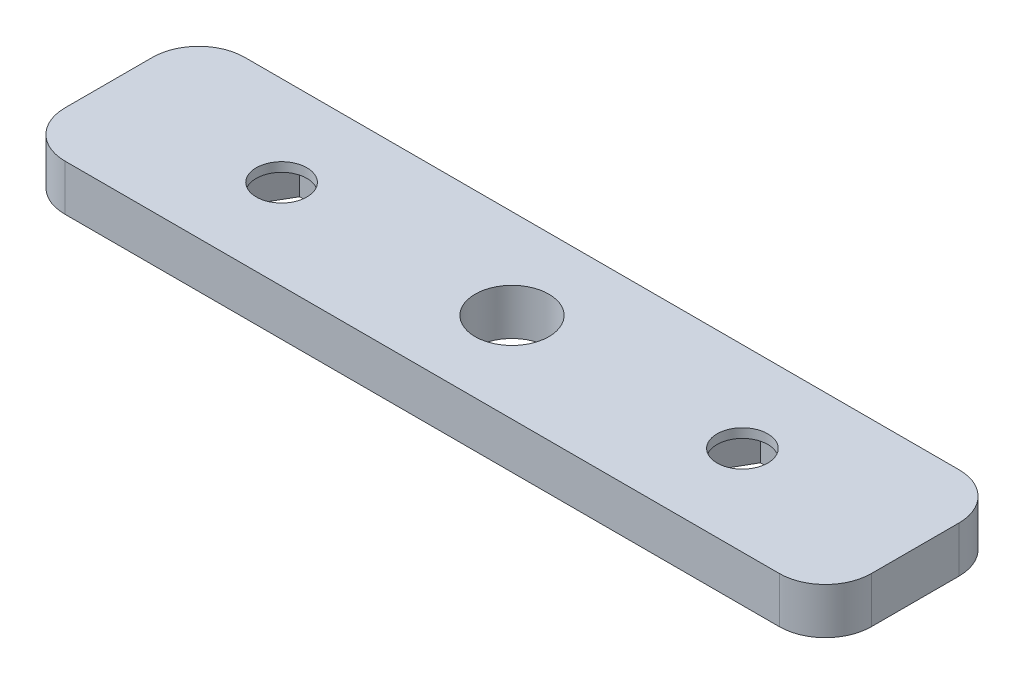
ISO-10303-21;
HEADER;
FILE_DESCRIPTION(('STEP AP214'),'2;1');
FILE_NAME('part.step','',(''),(''),'','','');
FILE_SCHEMA(('AUTOMOTIVE_DESIGN { 1 0 10303 214 1 1 1 1 }'));
ENDSEC;
DATA;
#1=APPLICATION_CONTEXT('core data for automotive mechanical design processes');
#2=APPLICATION_PROTOCOL_DEFINITION('international standard','automotive_design',2000,#1);
#3=PRODUCT_CONTEXT('',#1,'mechanical');
#4=PRODUCT('Part','Part','',(#3));
#5=PRODUCT_RELATED_PRODUCT_CATEGORY('part','',(#4));
#6=PRODUCT_DEFINITION_FORMATION('','',#4);
#7=PRODUCT_DEFINITION_CONTEXT('part definition',#1,'design');
#8=PRODUCT_DEFINITION('design','',#6,#7);
#9=PRODUCT_DEFINITION_SHAPE('','',#8);
#10=(LENGTH_UNIT() NAMED_UNIT(*) SI_UNIT(.MILLI.,.METRE.));
#11=(NAMED_UNIT(*) PLANE_ANGLE_UNIT() SI_UNIT($,.RADIAN.));
#12=(NAMED_UNIT(*) SI_UNIT($,.STERADIAN.) SOLID_ANGLE_UNIT());
#13=UNCERTAINTY_MEASURE_WITH_UNIT(LENGTH_MEASURE(1.E-05),#10,'distance_accuracy_value','');
#14=(GEOMETRIC_REPRESENTATION_CONTEXT(3) GLOBAL_UNCERTAINTY_ASSIGNED_CONTEXT((#13)) GLOBAL_UNIT_ASSIGNED_CONTEXT((#10,
#11,#12)) REPRESENTATION_CONTEXT('',''));
#15=CARTESIAN_POINT('',(0.,0.,0.));
#16=DIRECTION('',(0.,0.,1.));
#17=DIRECTION('',(1.,0.,0.));
#18=AXIS2_PLACEMENT_3D('',#15,#16,#17);
#19=CARTESIAN_POINT('',(0.,0.,0.));
#20=DIRECTION('',(0.,-1.,0.));
#21=DIRECTION('',(0.,0.,-1.));
#22=AXIS2_PLACEMENT_3D('',#19,#20,#21);
#23=PLANE('',#22);
#24=DIRECTION('',(0.5,0.,0.866025403784439));
#25=VECTOR('',#24,1.);
#26=CARTESIAN_POINT('',(17.8638040039984,0.,3.7));
#27=LINE('',#26,#25);
#28=CARTESIAN_POINT('',(15.7276080079968,0.,0.));
#29=VERTEX_POINT('',#28);
#30=CARTESIAN_POINT('',(17.8638040039984,0.,3.7));
#31=VERTEX_POINT('',#30);
#32=EDGE_CURVE('E214',#29,#31,#27,.T.);
#33=ORIENTED_EDGE('',*,*,#32,.T.);
#34=DIRECTION('',(1.,0.,0.));
#35=VECTOR('',#34,1.);
#36=CARTESIAN_POINT('',(22.1361959960016,0.,3.70000000000001));
#37=LINE('',#36,#35);
#38=CARTESIAN_POINT('',(22.1361959960016,0.,3.70000000000001));
#39=VERTEX_POINT('',#38);
#40=EDGE_CURVE('E66',#31,#39,#37,.T.);
#41=ORIENTED_EDGE('',*,*,#40,.T.);
#42=DIRECTION('',(0.5,0.,-0.866025403784438));
#43=VECTOR('',#42,1.);
#44=CARTESIAN_POINT('',(24.2723919920032,0.,0.));
#45=LINE('',#44,#43);
#46=CARTESIAN_POINT('',(24.2723919920032,0.,0.));
#47=VERTEX_POINT('',#46);
#48=EDGE_CURVE('E226',#39,#47,#45,.T.);
#49=ORIENTED_EDGE('',*,*,#48,.T.);
#50=DIRECTION('',(-0.499999999999999,0.,-0.866025403784439));
#51=VECTOR('',#50,1.);
#52=CARTESIAN_POINT('',(22.1361959960016,0.,-3.7));
#53=LINE('',#52,#51);
#54=CARTESIAN_POINT('',(22.1361959960016,0.,-3.7));
#55=VERTEX_POINT('',#54);
#56=EDGE_CURVE('E229',#47,#55,#53,.T.);
#57=ORIENTED_EDGE('',*,*,#56,.T.);
#58=DIRECTION('',(-1.,0.,0.));
#59=VECTOR('',#58,1.);
#60=CARTESIAN_POINT('',(17.8638040039984,0.,-3.7));
#61=LINE('',#60,#59);
#62=CARTESIAN_POINT('',(17.8638040039984,0.,-3.7));
#63=VERTEX_POINT('',#62);
#64=EDGE_CURVE('E232',#55,#63,#61,.T.);
#65=ORIENTED_EDGE('',*,*,#64,.T.);
#66=DIRECTION('',(-0.500000000000001,0.,0.866025403784438));
#67=VECTOR('',#66,1.);
#68=CARTESIAN_POINT('',(15.7276080079968,0.,0.));
#69=LINE('',#68,#67);
#70=EDGE_CURVE('E235',#63,#29,#69,.T.);
#71=ORIENTED_EDGE('',*,*,#70,.T.);
#72=EDGE_LOOP('',(#33,#41,#49,#57,#65,#71));
#73=FACE_BOUND('',#72,.T.);
#74=CARTESIAN_POINT('',(0.,0.,0.));
#75=DIRECTION('',(0.,-1.,0.));
#76=DIRECTION('',(0.,0.,-1.));
#77=AXIS2_PLACEMENT_3D('',#74,#75,#76);
#78=CIRCLE('',#77,3.2);
#79=CARTESIAN_POINT('',(0.,0.,-3.2));
#80=VERTEX_POINT('',#79);
#81=EDGE_CURVE('E260',#80,#80,#78,.F.);
#82=ORIENTED_EDGE('',*,*,#81,.T.);
#83=EDGE_LOOP('',(#82));
#84=FACE_BOUND('',#83,.T.);
#85=DIRECTION('',(-1.,0.,0.));
#86=VECTOR('',#85,1.);
#87=CARTESIAN_POINT('',(-35.,0.,-7.8));
#88=LINE('',#87,#86);
#89=CARTESIAN_POINT('',(31.,0.,-7.8));
#90=VERTEX_POINT('',#89);
#91=CARTESIAN_POINT('',(-31.,0.,-7.8));
#92=VERTEX_POINT('',#91);
#93=EDGE_CURVE('E278',#90,#92,#88,.T.);
#94=ORIENTED_EDGE('',*,*,#93,.F.);
#95=CARTESIAN_POINT('',(31.,0.,-3.8));
#96=DIRECTION('',(0.,-1.,0.));
#97=DIRECTION('',(0.,0.,-1.));
#98=AXIS2_PLACEMENT_3D('',#95,#96,#97);
#99=CIRCLE('',#98,4.);
#100=CARTESIAN_POINT('',(35.,0.,-3.8));
#101=VERTEX_POINT('',#100);
#102=EDGE_CURVE('E298',#90,#101,#99,.T.);
#103=ORIENTED_EDGE('',*,*,#102,.T.);
#104=DIRECTION('',(0.,0.,-1.));
#105=VECTOR('',#104,1.);
#106=CARTESIAN_POINT('',(35.,0.,7.8));
#107=LINE('',#106,#105);
#108=CARTESIAN_POINT('',(35.,0.,3.8));
#109=VERTEX_POINT('',#108);
#110=EDGE_CURVE('E275',#109,#101,#107,.T.);
#111=ORIENTED_EDGE('',*,*,#110,.F.);
#112=CARTESIAN_POINT('',(31.,0.,3.8));
#113=DIRECTION('',(0.,-1.,0.));
#114=DIRECTION('',(0.,0.,-1.));
#115=AXIS2_PLACEMENT_3D('',#112,#113,#114);
#116=CIRCLE('',#115,4.);
#117=CARTESIAN_POINT('',(31.,0.,7.8));
#118=VERTEX_POINT('',#117);
#119=EDGE_CURVE('E296',#109,#118,#116,.T.);
#120=ORIENTED_EDGE('',*,*,#119,.T.);
#121=DIRECTION('',(1.,0.,0.));
#122=VECTOR('',#121,1.);
#123=CARTESIAN_POINT('',(-35.,0.,7.8));
#124=LINE('',#123,#122);
#125=CARTESIAN_POINT('',(-31.,0.,7.8));
#126=VERTEX_POINT('',#125);
#127=EDGE_CURVE('E265',#126,#118,#124,.T.);
#128=ORIENTED_EDGE('',*,*,#127,.F.);
#129=CARTESIAN_POINT('',(-31.,0.,3.8));
#130=DIRECTION('',(0.,-1.,0.));
#131=DIRECTION('',(0.,0.,-1.));
#132=AXIS2_PLACEMENT_3D('',#129,#130,#131);
#133=CIRCLE('',#132,4.);
#134=CARTESIAN_POINT('',(-35.,0.,3.8));
#135=VERTEX_POINT('',#134);
#136=EDGE_CURVE('E294',#126,#135,#133,.T.);
#137=ORIENTED_EDGE('',*,*,#136,.T.);
#138=DIRECTION('',(0.,0.,1.));
#139=VECTOR('',#138,1.);
#140=CARTESIAN_POINT('',(-35.,0.,7.8));
#141=LINE('',#140,#139);
#142=CARTESIAN_POINT('',(-35.,0.,-3.8));
#143=VERTEX_POINT('',#142);
#144=EDGE_CURVE('E281',#143,#135,#141,.T.);
#145=ORIENTED_EDGE('',*,*,#144,.F.);
#146=CARTESIAN_POINT('',(-31.,0.,-3.8));
#147=DIRECTION('',(0.,-1.,0.));
#148=DIRECTION('',(0.,0.,-1.));
#149=AXIS2_PLACEMENT_3D('',#146,#147,#148);
#150=CIRCLE('',#149,4.);
#151=EDGE_CURVE('E292',#143,#92,#150,.T.);
#152=ORIENTED_EDGE('',*,*,#151,.T.);
#153=EDGE_LOOP('',(#94,#103,#111,#120,#128,#137,#145,#152));
#154=FACE_BOUND('',#153,.T.);
#155=DIRECTION('',(1.,0.,0.));
#156=VECTOR('',#155,1.);
#157=CARTESIAN_POINT('',(-22.1361959960016,0.,3.70000000000001));
#158=LINE('',#157,#156);
#159=CARTESIAN_POINT('',(-22.1361959960016,0.,3.70000000000001));
#160=VERTEX_POINT('',#159);
#161=CARTESIAN_POINT('',(-17.8638040039984,0.,3.7));
#162=VERTEX_POINT('',#161);
#163=EDGE_CURVE('E197',#160,#162,#158,.T.);
#164=ORIENTED_EDGE('',*,*,#163,.T.);
#165=DIRECTION('',(0.5,0.,-0.866025403784439));
#166=VECTOR('',#165,1.);
#167=CARTESIAN_POINT('',(-17.8638040039984,0.,3.7));
#168=LINE('',#167,#166);
#169=CARTESIAN_POINT('',(-15.7276080079968,0.,0.));
#170=VERTEX_POINT('',#169);
#171=EDGE_CURVE('E58',#162,#170,#168,.T.);
#172=ORIENTED_EDGE('',*,*,#171,.T.);
#173=DIRECTION('',(-0.500000000000001,0.,-0.866025403784438));
#174=VECTOR('',#173,1.);
#175=CARTESIAN_POINT('',(-15.7276080079968,0.,0.));
#176=LINE('',#175,#174);
#177=CARTESIAN_POINT('',(-17.8638040039984,0.,-3.7));
#178=VERTEX_POINT('',#177);
#179=EDGE_CURVE('E201',#170,#178,#176,.T.);
#180=ORIENTED_EDGE('',*,*,#179,.T.);
#181=DIRECTION('',(-1.,0.,0.));
#182=VECTOR('',#181,1.);
#183=CARTESIAN_POINT('',(-17.8638040039984,0.,-3.7));
#184=LINE('',#183,#182);
#185=CARTESIAN_POINT('',(-22.1361959960016,0.,-3.7));
#186=VERTEX_POINT('',#185);
#187=EDGE_CURVE('E645',#178,#186,#184,.T.);
#188=ORIENTED_EDGE('',*,*,#187,.T.);
#189=DIRECTION('',(-0.499999999999999,0.,0.866025403784439));
#190=VECTOR('',#189,1.);
#191=CARTESIAN_POINT('',(-22.1361959960016,0.,-3.7));
#192=LINE('',#191,#190);
#193=CARTESIAN_POINT('',(-24.2723919920032,0.,0.));
#194=VERTEX_POINT('',#193);
#195=EDGE_CURVE('E642',#186,#194,#192,.T.);
#196=ORIENTED_EDGE('',*,*,#195,.T.);
#197=DIRECTION('',(0.5,0.,0.866025403784438));
#198=VECTOR('',#197,1.);
#199=CARTESIAN_POINT('',(-24.2723919920032,0.,0.));
#200=LINE('',#199,#198);
#201=EDGE_CURVE('E636',#194,#160,#200,.T.);
#202=ORIENTED_EDGE('',*,*,#201,.T.);
#203=EDGE_LOOP('',(#164,#172,#180,#188,#196,#202));
#204=FACE_BOUND('',#203,.T.);
#205=ADVANCED_FACE('F41',(#73,#84,#154,#204),#23,.T.);
#206=CARTESIAN_POINT('',(20.,4.,0.));
#207=DIRECTION('',(0.,-1.,0.));
#208=DIRECTION('',(0.,0.,-1.));
#209=AXIS2_PLACEMENT_3D('',#206,#207,#208);
#210=CYLINDRICAL_SURFACE('',#209,2.2);
#211=CARTESIAN_POINT('',(20.,4.,0.));
#212=DIRECTION('',(0.,1.,0.));
#213=DIRECTION('',(0.,0.,1.));
#214=AXIS2_PLACEMENT_3D('',#211,#212,#213);
#215=CIRCLE('',#214,2.2);
#216=CARTESIAN_POINT('',(20.,4.,2.2));
#217=VERTEX_POINT('',#216);
#218=EDGE_CURVE('E251',#217,#217,#215,.T.);
#219=ORIENTED_EDGE('',*,*,#218,.T.);
#220=EDGE_LOOP('',(#219));
#221=FACE_BOUND('',#220,.T.);
#222=CARTESIAN_POINT('',(20.,3.2,0.));
#223=DIRECTION('',(0.,-1.,0.));
#224=DIRECTION('',(0.,0.,-1.));
#225=AXIS2_PLACEMENT_3D('',#222,#223,#224);
#226=CIRCLE('',#225,2.2);
#227=CARTESIAN_POINT('',(20.,3.2,-2.2));
#228=VERTEX_POINT('',#227);
#229=EDGE_CURVE('E45',#228,#228,#226,.T.);
#230=ORIENTED_EDGE('',*,*,#229,.T.);
#231=EDGE_LOOP('',(#230));
#232=FACE_BOUND('',#231,.T.);
#233=ADVANCED_FACE('F365',(#221,#232),#210,.F.);
#234=CARTESIAN_POINT('',(35.,4.,7.8));
#235=DIRECTION('',(-1.,0.,0.));
#236=DIRECTION('',(0.,0.,1.));
#237=AXIS2_PLACEMENT_3D('',#234,#235,#236);
#238=PLANE('',#237);
#239=ORIENTED_EDGE('',*,*,#110,.T.);
#240=DIRECTION('',(0.,-1.,0.));
#241=VECTOR('',#240,1.);
#242=CARTESIAN_POINT('',(35.,4.,-3.8));
#243=LINE('',#242,#241);
#244=CARTESIAN_POINT('',(35.,4.,-3.8));
#245=VERTEX_POINT('',#244);
#246=EDGE_CURVE('E303',#101,#245,#243,.F.);
#247=ORIENTED_EDGE('',*,*,#246,.T.);
#248=DIRECTION('',(0.,0.,-1.));
#249=VECTOR('',#248,1.);
#250=CARTESIAN_POINT('',(35.,4.,7.8));
#251=LINE('',#250,#249);
#252=CARTESIAN_POINT('',(35.,4.,3.8));
#253=VERTEX_POINT('',#252);
#254=EDGE_CURVE('E261',#253,#245,#251,.T.);
#255=ORIENTED_EDGE('',*,*,#254,.F.);
#256=DIRECTION('',(0.,-1.,0.));
#257=VECTOR('',#256,1.);
#258=CARTESIAN_POINT('',(35.,4.,3.8));
#259=LINE('',#258,#257);
#260=EDGE_CURVE('E300',#253,#109,#259,.T.);
#261=ORIENTED_EDGE('',*,*,#260,.T.);
#262=EDGE_LOOP('',(#239,#247,#255,#261));
#263=FACE_BOUND('',#262,.T.);
#264=ADVANCED_FACE('F348',(#263),#238,.F.);
#265=CARTESIAN_POINT('',(-35.,4.,-7.8));
#266=DIRECTION('',(0.,0.,1.));
#267=DIRECTION('',(1.,0.,0.));
#268=AXIS2_PLACEMENT_3D('',#265,#266,#267);
#269=PLANE('',#268);
#270=DIRECTION('',(-1.,0.,0.));
#271=VECTOR('',#270,1.);
#272=CARTESIAN_POINT('',(-35.,4.,-7.8));
#273=LINE('',#272,#271);
#274=CARTESIAN_POINT('',(31.,4.,-7.8));
#275=VERTEX_POINT('',#274);
#276=CARTESIAN_POINT('',(-31.,4.,-7.8));
#277=VERTEX_POINT('',#276);
#278=EDGE_CURVE('E264',#275,#277,#273,.T.);
#279=ORIENTED_EDGE('',*,*,#278,.F.);
#280=DIRECTION('',(0.,-1.,0.));
#281=VECTOR('',#280,1.);
#282=CARTESIAN_POINT('',(31.,4.,-7.8));
#283=LINE('',#282,#281);
#284=EDGE_CURVE('E289',#275,#90,#283,.T.);
#285=ORIENTED_EDGE('',*,*,#284,.T.);
#286=ORIENTED_EDGE('',*,*,#93,.T.);
#287=DIRECTION('',(0.,-1.,0.));
#288=VECTOR('',#287,1.);
#289=CARTESIAN_POINT('',(-31.,4.,-7.8));
#290=LINE('',#289,#288);
#291=EDGE_CURVE('E274',#92,#277,#290,.F.);
#292=ORIENTED_EDGE('',*,*,#291,.T.);
#293=EDGE_LOOP('',(#279,#285,#286,#292));
#294=FACE_BOUND('',#293,.T.);
#295=ADVANCED_FACE('F356',(#294),#269,.F.);
#296=CARTESIAN_POINT('',(-35.,4.,7.8));
#297=DIRECTION('',(1.,0.,0.));
#298=DIRECTION('',(0.,0.,-1.));
#299=AXIS2_PLACEMENT_3D('',#296,#297,#298);
#300=PLANE('',#299);
#301=ORIENTED_EDGE('',*,*,#144,.T.);
#302=DIRECTION('',(0.,-1.,0.));
#303=VECTOR('',#302,1.);
#304=CARTESIAN_POINT('',(-35.,4.,3.8));
#305=LINE('',#304,#303);
#306=CARTESIAN_POINT('',(-35.,4.,3.8));
#307=VERTEX_POINT('',#306);
#308=EDGE_CURVE('E11',#135,#307,#305,.F.);
#309=ORIENTED_EDGE('',*,*,#308,.T.);
#310=DIRECTION('',(0.,0.,1.));
#311=VECTOR('',#310,1.);
#312=CARTESIAN_POINT('',(-35.,4.,7.8));
#313=LINE('',#312,#311);
#314=CARTESIAN_POINT('',(-35.,4.,-3.8));
#315=VERTEX_POINT('',#314);
#316=EDGE_CURVE('E268',#315,#307,#313,.T.);
#317=ORIENTED_EDGE('',*,*,#316,.F.);
#318=DIRECTION('',(0.,-1.,0.));
#319=VECTOR('',#318,1.);
#320=CARTESIAN_POINT('',(-35.,4.,-3.8));
#321=LINE('',#320,#319);
#322=EDGE_CURVE('E50',#315,#143,#321,.T.);
#323=ORIENTED_EDGE('',*,*,#322,.T.);
#324=EDGE_LOOP('',(#301,#309,#317,#323));
#325=FACE_BOUND('',#324,.T.);
#326=ADVANCED_FACE('F323',(#325),#300,.F.);
#327=CARTESIAN_POINT('',(-35.,4.,7.8));
#328=DIRECTION('',(0.,0.,-1.));
#329=DIRECTION('',(-1.,0.,0.));
#330=AXIS2_PLACEMENT_3D('',#327,#328,#329);
#331=PLANE('',#330);
#332=ORIENTED_EDGE('',*,*,#127,.T.);
#333=DIRECTION('',(0.,-1.,0.));
#334=VECTOR('',#333,1.);
#335=CARTESIAN_POINT('',(31.,4.,7.8));
#336=LINE('',#335,#334);
#337=CARTESIAN_POINT('',(31.,4.,7.8));
#338=VERTEX_POINT('',#337);
#339=EDGE_CURVE('E316',#118,#338,#336,.F.);
#340=ORIENTED_EDGE('',*,*,#339,.T.);
#341=DIRECTION('',(1.,0.,0.));
#342=VECTOR('',#341,1.);
#343=CARTESIAN_POINT('',(-35.,4.,7.8));
#344=LINE('',#343,#342);
#345=CARTESIAN_POINT('',(-31.,4.,7.8));
#346=VERTEX_POINT('',#345);
#347=EDGE_CURVE('E271',#346,#338,#344,.T.);
#348=ORIENTED_EDGE('',*,*,#347,.F.);
#349=DIRECTION('',(0.,-1.,0.));
#350=VECTOR('',#349,1.);
#351=CARTESIAN_POINT('',(-31.,4.,7.8));
#352=LINE('',#351,#350);
#353=EDGE_CURVE('E313',#346,#126,#352,.T.);
#354=ORIENTED_EDGE('',*,*,#353,.T.);
#355=EDGE_LOOP('',(#332,#340,#348,#354));
#356=FACE_BOUND('',#355,.T.);
#357=ADVANCED_FACE('F337',(#356),#331,.F.);
#358=CARTESIAN_POINT('',(0.,4.,0.));
#359=DIRECTION('',(0.,-1.,0.));
#360=DIRECTION('',(0.,0.,-1.));
#361=AXIS2_PLACEMENT_3D('',#358,#359,#360);
#362=PLANE('',#361);
#363=CARTESIAN_POINT('',(-20.,4.,0.));
#364=DIRECTION('',(0.,1.,0.));
#365=DIRECTION('',(0.,0.,-1.));
#366=AXIS2_PLACEMENT_3D('',#363,#364,#365);
#367=CIRCLE('',#366,2.2);
#368=CARTESIAN_POINT('',(-20.,4.,-2.2));
#369=VERTEX_POINT('',#368);
#370=EDGE_CURVE('E255',#369,#369,#367,.T.);
#371=ORIENTED_EDGE('',*,*,#370,.F.);
#372=EDGE_LOOP('',(#371));
#373=FACE_BOUND('',#372,.T.);
#374=ORIENTED_EDGE('',*,*,#218,.F.);
#375=EDGE_LOOP('',(#374));
#376=FACE_BOUND('',#375,.T.);
#377=CARTESIAN_POINT('',(0.,4.,0.));
#378=DIRECTION('',(0.,1.,0.));
#379=DIRECTION('',(0.,0.,1.));
#380=AXIS2_PLACEMENT_3D('',#377,#378,#379);
#381=CIRCLE('',#380,3.2);
#382=CARTESIAN_POINT('',(0.,4.,3.2));
#383=VERTEX_POINT('',#382);
#384=EDGE_CURVE('E254',#383,#383,#381,.T.);
#385=ORIENTED_EDGE('',*,*,#384,.F.);
#386=EDGE_LOOP('',(#385));
#387=FACE_BOUND('',#386,.T.);
#388=ORIENTED_EDGE('',*,*,#254,.T.);
#389=CARTESIAN_POINT('',(31.,4.,-3.8));
#390=DIRECTION('',(0.,-1.,0.));
#391=DIRECTION('',(0.,0.,-1.));
#392=AXIS2_PLACEMENT_3D('',#389,#390,#391);
#393=CIRCLE('',#392,4.);
#394=EDGE_CURVE('E311',#245,#275,#393,.F.);
#395=ORIENTED_EDGE('',*,*,#394,.T.);
#396=ORIENTED_EDGE('',*,*,#278,.T.);
#397=CARTESIAN_POINT('',(-31.,4.,-3.8));
#398=DIRECTION('',(0.,-1.,0.));
#399=DIRECTION('',(0.,0.,-1.));
#400=AXIS2_PLACEMENT_3D('',#397,#398,#399);
#401=CIRCLE('',#400,4.);
#402=EDGE_CURVE('E305',#277,#315,#401,.F.);
#403=ORIENTED_EDGE('',*,*,#402,.T.);
#404=ORIENTED_EDGE('',*,*,#316,.T.);
#405=CARTESIAN_POINT('',(-31.,4.,3.8));
#406=DIRECTION('',(0.,-1.,0.));
#407=DIRECTION('',(0.,0.,-1.));
#408=AXIS2_PLACEMENT_3D('',#405,#406,#407);
#409=CIRCLE('',#408,4.);
#410=EDGE_CURVE('E307',#307,#346,#409,.F.);
#411=ORIENTED_EDGE('',*,*,#410,.T.);
#412=ORIENTED_EDGE('',*,*,#347,.T.);
#413=CARTESIAN_POINT('',(31.,4.,3.8));
#414=DIRECTION('',(0.,-1.,0.));
#415=DIRECTION('',(0.,0.,-1.));
#416=AXIS2_PLACEMENT_3D('',#413,#414,#415);
#417=CIRCLE('',#416,4.);
#418=EDGE_CURVE('E309',#338,#253,#417,.F.);
#419=ORIENTED_EDGE('',*,*,#418,.T.);
#420=EDGE_LOOP('',(#388,#395,#396,#403,#404,#411,#412,#419));
#421=FACE_BOUND('',#420,.T.);
#422=ADVANCED_FACE('F341',(#373,#376,#387,#421),#362,.F.);
#423=CARTESIAN_POINT('',(0.,4.,0.));
#424=DIRECTION('',(0.,-1.,0.));
#425=DIRECTION('',(0.,0.,-1.));
#426=AXIS2_PLACEMENT_3D('',#423,#424,#425);
#427=CYLINDRICAL_SURFACE('',#426,3.2);
#428=ORIENTED_EDGE('',*,*,#81,.F.);
#429=EDGE_LOOP('',(#428));
#430=FACE_BOUND('',#429,.T.);
#431=ORIENTED_EDGE('',*,*,#384,.T.);
#432=EDGE_LOOP('',(#431));
#433=FACE_BOUND('',#432,.T.);
#434=ADVANCED_FACE('F421',(#430,#433),#427,.F.);
#435=CARTESIAN_POINT('',(-20.,4.,0.));
#436=DIRECTION('',(0.,-1.,0.));
#437=DIRECTION('',(0.,0.,-1.));
#438=AXIS2_PLACEMENT_3D('',#435,#436,#437);
#439=CYLINDRICAL_SURFACE('',#438,2.2);
#440=CARTESIAN_POINT('',(-20.,3.2,0.));
#441=DIRECTION('',(0.,1.,0.));
#442=DIRECTION('',(0.,0.,1.));
#443=AXIS2_PLACEMENT_3D('',#440,#441,#442);
#444=CIRCLE('',#443,2.2);
#445=CARTESIAN_POINT('',(-20.,3.2,2.2));
#446=VERTEX_POINT('',#445);
#447=EDGE_CURVE('E202',#446,#446,#444,.T.);
#448=ORIENTED_EDGE('',*,*,#447,.F.);
#449=EDGE_LOOP('',(#448));
#450=FACE_BOUND('',#449,.T.);
#451=ORIENTED_EDGE('',*,*,#370,.T.);
#452=EDGE_LOOP('',(#451));
#453=FACE_BOUND('',#452,.T.);
#454=ADVANCED_FACE('F387',(#450,#453),#439,.F.);
#455=CARTESIAN_POINT('',(31.,4.,-3.8));
#456=DIRECTION('',(0.,-1.,0.));
#457=DIRECTION('',(0.,0.,-1.));
#458=AXIS2_PLACEMENT_3D('',#455,#456,#457);
#459=CYLINDRICAL_SURFACE('',#458,4.);
#460=ORIENTED_EDGE('',*,*,#394,.F.);
#461=ORIENTED_EDGE('',*,*,#246,.F.);
#462=ORIENTED_EDGE('',*,*,#102,.F.);
#463=ORIENTED_EDGE('',*,*,#284,.F.);
#464=EDGE_LOOP('',(#460,#461,#462,#463));
#465=FACE_BOUND('',#464,.T.);
#466=ADVANCED_FACE('F353',(#465),#459,.T.);
#467=CARTESIAN_POINT('',(31.,4.,3.8));
#468=DIRECTION('',(0.,-1.,0.));
#469=DIRECTION('',(0.,0.,-1.));
#470=AXIS2_PLACEMENT_3D('',#467,#468,#469);
#471=CYLINDRICAL_SURFACE('',#470,4.);
#472=ORIENTED_EDGE('',*,*,#418,.F.);
#473=ORIENTED_EDGE('',*,*,#339,.F.);
#474=ORIENTED_EDGE('',*,*,#119,.F.);
#475=ORIENTED_EDGE('',*,*,#260,.F.);
#476=EDGE_LOOP('',(#472,#473,#474,#475));
#477=FACE_BOUND('',#476,.T.);
#478=ADVANCED_FACE('F345',(#477),#471,.T.);
#479=CARTESIAN_POINT('',(-31.,4.,3.8));
#480=DIRECTION('',(0.,-1.,0.));
#481=DIRECTION('',(0.,0.,-1.));
#482=AXIS2_PLACEMENT_3D('',#479,#480,#481);
#483=CYLINDRICAL_SURFACE('',#482,4.);
#484=ORIENTED_EDGE('',*,*,#410,.F.);
#485=ORIENTED_EDGE('',*,*,#308,.F.);
#486=ORIENTED_EDGE('',*,*,#136,.F.);
#487=ORIENTED_EDGE('',*,*,#353,.F.);
#488=EDGE_LOOP('',(#484,#485,#486,#487));
#489=FACE_BOUND('',#488,.T.);
#490=ADVANCED_FACE('F334',(#489),#483,.T.);
#491=CARTESIAN_POINT('',(-31.,4.,-3.8));
#492=DIRECTION('',(0.,-1.,0.));
#493=DIRECTION('',(0.,0.,-1.));
#494=AXIS2_PLACEMENT_3D('',#491,#492,#493);
#495=CYLINDRICAL_SURFACE('',#494,4.);
#496=ORIENTED_EDGE('',*,*,#402,.F.);
#497=ORIENTED_EDGE('',*,*,#291,.F.);
#498=ORIENTED_EDGE('',*,*,#151,.F.);
#499=ORIENTED_EDGE('',*,*,#322,.F.);
#500=EDGE_LOOP('',(#496,#497,#498,#499));
#501=FACE_BOUND('',#500,.T.);
#502=ADVANCED_FACE('F43',(#501),#495,.T.);
#503=CARTESIAN_POINT('',(-17.8638040039984,3.2,3.7));
#504=DIRECTION('',(-0.866025403784439,0.,-0.5));
#505=DIRECTION('',(-0.5,0.,0.866025403784439));
#506=AXIS2_PLACEMENT_3D('',#503,#504,#505);
#507=PLANE('',#506);
#508=ORIENTED_EDGE('',*,*,#171,.F.);
#509=DIRECTION('',(0.,-1.,0.));
#510=VECTOR('',#509,1.);
#511=CARTESIAN_POINT('',(-17.8638040039984,3.2,3.7));
#512=LINE('',#511,#510);
#513=CARTESIAN_POINT('',(-17.8638040039984,3.2,3.7));
#514=VERTEX_POINT('',#513);
#515=EDGE_CURVE('E196',#514,#162,#512,.T.);
#516=ORIENTED_EDGE('',*,*,#515,.F.);
#517=DIRECTION('',(0.5,0.,-0.866025403784439));
#518=VECTOR('',#517,1.);
#519=CARTESIAN_POINT('',(-17.8638040039984,3.2,3.7));
#520=LINE('',#519,#518);
#521=CARTESIAN_POINT('',(-15.7276080079968,3.2,0.));
#522=VERTEX_POINT('',#521);
#523=EDGE_CURVE('E187',#514,#522,#520,.T.);
#524=ORIENTED_EDGE('',*,*,#523,.T.);
#525=DIRECTION('',(0.,-1.,0.));
#526=VECTOR('',#525,1.);
#527=CARTESIAN_POINT('',(-15.7276080079968,3.2,0.));
#528=LINE('',#527,#526);
#529=EDGE_CURVE('E195',#522,#170,#528,.T.);
#530=ORIENTED_EDGE('',*,*,#529,.T.);
#531=EDGE_LOOP('',(#508,#516,#524,#530));
#532=FACE_BOUND('',#531,.T.);
#533=ADVANCED_FACE('F194',(#532),#507,.T.);
#534=CARTESIAN_POINT('',(-15.7276080079968,3.2,0.));
#535=DIRECTION('',(-0.866025403784438,0.,0.500000000000001));
#536=DIRECTION('',(0.500000000000001,0.,0.866025403784438));
#537=AXIS2_PLACEMENT_3D('',#534,#535,#536);
#538=PLANE('',#537);
#539=ORIENTED_EDGE('',*,*,#179,.F.);
#540=ORIENTED_EDGE('',*,*,#529,.F.);
#541=DIRECTION('',(-0.500000000000001,0.,-0.866025403784438));
#542=VECTOR('',#541,1.);
#543=CARTESIAN_POINT('',(-15.7276080079968,3.2,0.));
#544=LINE('',#543,#542);
#545=CARTESIAN_POINT('',(-17.8638040039984,3.2,-3.7));
#546=VERTEX_POINT('',#545);
#547=EDGE_CURVE('E183',#522,#546,#544,.T.);
#548=ORIENTED_EDGE('',*,*,#547,.T.);
#549=DIRECTION('',(0.,-1.,0.));
#550=VECTOR('',#549,1.);
#551=CARTESIAN_POINT('',(-17.8638040039984,3.2,-3.7));
#552=LINE('',#551,#550);
#553=EDGE_CURVE('E203',#546,#178,#552,.T.);
#554=ORIENTED_EDGE('',*,*,#553,.T.);
#555=EDGE_LOOP('',(#539,#540,#548,#554));
#556=FACE_BOUND('',#555,.T.);
#557=ADVANCED_FACE('F199',(#556),#538,.T.);
#558=CARTESIAN_POINT('',(-17.8638040039984,3.2,-3.7));
#559=DIRECTION('',(0.,0.,1.));
#560=DIRECTION('',(1.,0.,0.));
#561=AXIS2_PLACEMENT_3D('',#558,#559,#560);
#562=PLANE('',#561);
#563=ORIENTED_EDGE('',*,*,#187,.F.);
#564=ORIENTED_EDGE('',*,*,#553,.F.);
#565=DIRECTION('',(-1.,0.,0.));
#566=VECTOR('',#565,1.);
#567=CARTESIAN_POINT('',(-17.8638040039984,3.2,-3.7));
#568=LINE('',#567,#566);
#569=CARTESIAN_POINT('',(-22.1361959960016,3.2,-3.7));
#570=VERTEX_POINT('',#569);
#571=EDGE_CURVE('E189',#546,#570,#568,.T.);
#572=ORIENTED_EDGE('',*,*,#571,.T.);
#573=DIRECTION('',(0.,-1.,0.));
#574=VECTOR('',#573,1.);
#575=CARTESIAN_POINT('',(-22.1361959960016,3.2,-3.7));
#576=LINE('',#575,#574);
#577=EDGE_CURVE('E206',#570,#186,#576,.T.);
#578=ORIENTED_EDGE('',*,*,#577,.T.);
#579=EDGE_LOOP('',(#563,#564,#572,#578));
#580=FACE_BOUND('',#579,.T.);
#581=ADVANCED_FACE('F439',(#580),#562,.T.);
#582=CARTESIAN_POINT('',(-22.1361959960016,3.2,-3.7));
#583=DIRECTION('',(0.866025403784439,0.,0.499999999999999));
#584=DIRECTION('',(0.499999999999999,0.,-0.866025403784439));
#585=AXIS2_PLACEMENT_3D('',#582,#583,#584);
#586=PLANE('',#585);
#587=ORIENTED_EDGE('',*,*,#195,.F.);
#588=ORIENTED_EDGE('',*,*,#577,.F.);
#589=DIRECTION('',(-0.499999999999999,0.,0.866025403784439));
#590=VECTOR('',#589,1.);
#591=CARTESIAN_POINT('',(-22.1361959960016,3.2,-3.7));
#592=LINE('',#591,#590);
#593=CARTESIAN_POINT('',(-24.2723919920032,3.2,0.));
#594=VERTEX_POINT('',#593);
#595=EDGE_CURVE('E661',#570,#594,#592,.T.);
#596=ORIENTED_EDGE('',*,*,#595,.T.);
#597=DIRECTION('',(0.,-1.,0.));
#598=VECTOR('',#597,1.);
#599=CARTESIAN_POINT('',(-24.2723919920032,3.2,0.));
#600=LINE('',#599,#598);
#601=EDGE_CURVE('E652',#594,#194,#600,.T.);
#602=ORIENTED_EDGE('',*,*,#601,.T.);
#603=EDGE_LOOP('',(#587,#588,#596,#602));
#604=FACE_BOUND('',#603,.T.);
#605=ADVANCED_FACE('F448',(#604),#586,.T.);
#606=CARTESIAN_POINT('',(-24.2723919920032,3.2,0.));
#607=DIRECTION('',(0.866025403784438,0.,-0.5));
#608=DIRECTION('',(-0.5,0.,-0.866025403784438));
#609=AXIS2_PLACEMENT_3D('',#606,#607,#608);
#610=PLANE('',#609);
#611=ORIENTED_EDGE('',*,*,#201,.F.);
#612=ORIENTED_EDGE('',*,*,#601,.F.);
#613=DIRECTION('',(0.5,0.,0.866025403784438));
#614=VECTOR('',#613,1.);
#615=CARTESIAN_POINT('',(-24.2723919920032,3.2,0.));
#616=LINE('',#615,#614);
#617=CARTESIAN_POINT('',(-22.1361959960016,3.2,3.70000000000001));
#618=VERTEX_POINT('',#617);
#619=EDGE_CURVE('E659',#594,#618,#616,.T.);
#620=ORIENTED_EDGE('',*,*,#619,.T.);
#621=DIRECTION('',(0.,-1.,0.));
#622=VECTOR('',#621,1.);
#623=CARTESIAN_POINT('',(-22.1361959960016,3.2,3.70000000000001));
#624=LINE('',#623,#622);
#625=EDGE_CURVE('E635',#618,#160,#624,.T.);
#626=ORIENTED_EDGE('',*,*,#625,.T.);
#627=EDGE_LOOP('',(#611,#612,#620,#626));
#628=FACE_BOUND('',#627,.T.);
#629=ADVANCED_FACE('F458',(#628),#610,.T.);
#630=CARTESIAN_POINT('',(-22.1361959960016,3.2,3.70000000000001));
#631=DIRECTION('',(0.,0.,-1.));
#632=DIRECTION('',(-1.,0.,0.));
#633=AXIS2_PLACEMENT_3D('',#630,#631,#632);
#634=PLANE('',#633);
#635=ORIENTED_EDGE('',*,*,#163,.F.);
#636=ORIENTED_EDGE('',*,*,#625,.F.);
#637=DIRECTION('',(1.,0.,0.));
#638=VECTOR('',#637,1.);
#639=CARTESIAN_POINT('',(-22.1361959960016,3.2,3.70000000000001));
#640=LINE('',#639,#638);
#641=EDGE_CURVE('E650',#618,#514,#640,.T.);
#642=ORIENTED_EDGE('',*,*,#641,.T.);
#643=ORIENTED_EDGE('',*,*,#515,.T.);
#644=EDGE_LOOP('',(#635,#636,#642,#643));
#645=FACE_BOUND('',#644,.T.);
#646=ADVANCED_FACE('F468',(#645),#634,.T.);
#647=CARTESIAN_POINT('',(0.,3.2,0.));
#648=DIRECTION('',(0.,1.,0.));
#649=DIRECTION('',(0.,0.,1.));
#650=AXIS2_PLACEMENT_3D('',#647,#648,#649);
#651=PLANE('',#650);
#652=ORIENTED_EDGE('',*,*,#447,.T.);
#653=EDGE_LOOP('',(#652));
#654=FACE_BOUND('',#653,.T.);
#655=ORIENTED_EDGE('',*,*,#523,.F.);
#656=ORIENTED_EDGE('',*,*,#641,.F.);
#657=ORIENTED_EDGE('',*,*,#619,.F.);
#658=ORIENTED_EDGE('',*,*,#595,.F.);
#659=ORIENTED_EDGE('',*,*,#571,.F.);
#660=ORIENTED_EDGE('',*,*,#547,.F.);
#661=EDGE_LOOP('',(#655,#656,#657,#658,#659,#660));
#662=FACE_BOUND('',#661,.T.);
#663=ADVANCED_FACE('F185',(#654,#662),#651,.F.);
#664=CARTESIAN_POINT('',(22.1361959960016,3.2,3.70000000000001));
#665=DIRECTION('',(0.,0.,-1.));
#666=DIRECTION('',(-1.,0.,0.));
#667=AXIS2_PLACEMENT_3D('',#664,#665,#666);
#668=PLANE('',#667);
#669=ORIENTED_EDGE('',*,*,#40,.F.);
#670=DIRECTION('',(0.,-1.,0.));
#671=VECTOR('',#670,1.);
#672=CARTESIAN_POINT('',(17.8638040039984,3.2,3.7));
#673=LINE('',#672,#671);
#674=CARTESIAN_POINT('',(17.8638040039984,3.2,3.7));
#675=VERTEX_POINT('',#674);
#676=EDGE_CURVE('E224',#675,#31,#673,.T.);
#677=ORIENTED_EDGE('',*,*,#676,.F.);
#678=DIRECTION('',(1.,0.,0.));
#679=VECTOR('',#678,1.);
#680=CARTESIAN_POINT('',(22.1361959960016,3.2,3.70000000000001));
#681=LINE('',#680,#679);
#682=CARTESIAN_POINT('',(22.1361959960016,3.2,3.70000000000001));
#683=VERTEX_POINT('',#682);
#684=EDGE_CURVE('E210',#675,#683,#681,.T.);
#685=ORIENTED_EDGE('',*,*,#684,.T.);
#686=DIRECTION('',(0.,-1.,0.));
#687=VECTOR('',#686,1.);
#688=CARTESIAN_POINT('',(22.1361959960016,3.2,3.70000000000001));
#689=LINE('',#688,#687);
#690=EDGE_CURVE('E249',#683,#39,#689,.T.);
#691=ORIENTED_EDGE('',*,*,#690,.T.);
#692=EDGE_LOOP('',(#669,#677,#685,#691));
#693=FACE_BOUND('',#692,.T.);
#694=ADVANCED_FACE('F487',(#693),#668,.T.);
#695=CARTESIAN_POINT('',(24.2723919920032,3.2,0.));
#696=DIRECTION('',(-0.866025403784438,0.,-0.5));
#697=DIRECTION('',(-0.5,0.,0.866025403784438));
#698=AXIS2_PLACEMENT_3D('',#695,#696,#697);
#699=PLANE('',#698);
#700=ORIENTED_EDGE('',*,*,#48,.F.);
#701=ORIENTED_EDGE('',*,*,#690,.F.);
#702=DIRECTION('',(0.5,0.,-0.866025403784438));
#703=VECTOR('',#702,1.);
#704=CARTESIAN_POINT('',(24.2723919920032,3.2,0.));
#705=LINE('',#704,#703);
#706=CARTESIAN_POINT('',(24.2723919920032,3.2,0.));
#707=VERTEX_POINT('',#706);
#708=EDGE_CURVE('E213',#683,#707,#705,.T.);
#709=ORIENTED_EDGE('',*,*,#708,.T.);
#710=DIRECTION('',(0.,-1.,0.));
#711=VECTOR('',#710,1.);
#712=CARTESIAN_POINT('',(24.2723919920032,3.2,0.));
#713=LINE('',#712,#711);
#714=EDGE_CURVE('E247',#707,#47,#713,.T.);
#715=ORIENTED_EDGE('',*,*,#714,.T.);
#716=EDGE_LOOP('',(#700,#701,#709,#715));
#717=FACE_BOUND('',#716,.T.);
#718=ADVANCED_FACE('F497',(#717),#699,.T.);
#719=CARTESIAN_POINT('',(22.1361959960016,3.2,-3.7));
#720=DIRECTION('',(-0.866025403784439,0.,0.499999999999999));
#721=DIRECTION('',(0.499999999999999,0.,0.866025403784439));
#722=AXIS2_PLACEMENT_3D('',#719,#720,#721);
#723=PLANE('',#722);
#724=ORIENTED_EDGE('',*,*,#56,.F.);
#725=ORIENTED_EDGE('',*,*,#714,.F.);
#726=DIRECTION('',(-0.499999999999999,0.,-0.866025403784439));
#727=VECTOR('',#726,1.);
#728=CARTESIAN_POINT('',(22.1361959960016,3.2,-3.7));
#729=LINE('',#728,#727);
#730=CARTESIAN_POINT('',(22.1361959960016,3.2,-3.7));
#731=VERTEX_POINT('',#730);
#732=EDGE_CURVE('E216',#707,#731,#729,.T.);
#733=ORIENTED_EDGE('',*,*,#732,.T.);
#734=DIRECTION('',(0.,-1.,0.));
#735=VECTOR('',#734,1.);
#736=CARTESIAN_POINT('',(22.1361959960016,3.2,-3.7));
#737=LINE('',#736,#735);
#738=EDGE_CURVE('E245',#731,#55,#737,.T.);
#739=ORIENTED_EDGE('',*,*,#738,.T.);
#740=EDGE_LOOP('',(#724,#725,#733,#739));
#741=FACE_BOUND('',#740,.T.);
#742=ADVANCED_FACE('F506',(#741),#723,.T.);
#743=CARTESIAN_POINT('',(17.8638040039984,3.2,-3.7));
#744=DIRECTION('',(0.,0.,1.));
#745=DIRECTION('',(1.,0.,0.));
#746=AXIS2_PLACEMENT_3D('',#743,#744,#745);
#747=PLANE('',#746);
#748=ORIENTED_EDGE('',*,*,#64,.F.);
#749=ORIENTED_EDGE('',*,*,#738,.F.);
#750=DIRECTION('',(-1.,0.,0.));
#751=VECTOR('',#750,1.);
#752=CARTESIAN_POINT('',(17.8638040039984,3.2,-3.7));
#753=LINE('',#752,#751);
#754=CARTESIAN_POINT('',(17.8638040039984,3.2,-3.7));
#755=VERTEX_POINT('',#754);
#756=EDGE_CURVE('E218',#731,#755,#753,.T.);
#757=ORIENTED_EDGE('',*,*,#756,.T.);
#758=DIRECTION('',(0.,-1.,0.));
#759=VECTOR('',#758,1.);
#760=CARTESIAN_POINT('',(17.8638040039984,3.2,-3.7));
#761=LINE('',#760,#759);
#762=EDGE_CURVE('E243',#755,#63,#761,.T.);
#763=ORIENTED_EDGE('',*,*,#762,.T.);
#764=EDGE_LOOP('',(#748,#749,#757,#763));
#765=FACE_BOUND('',#764,.T.);
#766=ADVANCED_FACE('F516',(#765),#747,.T.);
#767=CARTESIAN_POINT('',(15.7276080079968,3.2,0.));
#768=DIRECTION('',(0.866025403784438,0.,0.500000000000001));
#769=DIRECTION('',(0.500000000000001,0.,-0.866025403784438));
#770=AXIS2_PLACEMENT_3D('',#767,#768,#769);
#771=PLANE('',#770);
#772=ORIENTED_EDGE('',*,*,#70,.F.);
#773=ORIENTED_EDGE('',*,*,#762,.F.);
#774=DIRECTION('',(-0.500000000000001,0.,0.866025403784438));
#775=VECTOR('',#774,1.);
#776=CARTESIAN_POINT('',(15.7276080079968,3.2,0.));
#777=LINE('',#776,#775);
#778=CARTESIAN_POINT('',(15.7276080079968,3.2,0.));
#779=VERTEX_POINT('',#778);
#780=EDGE_CURVE('E220',#755,#779,#777,.T.);
#781=ORIENTED_EDGE('',*,*,#780,.T.);
#782=DIRECTION('',(0.,-1.,0.));
#783=VECTOR('',#782,1.);
#784=CARTESIAN_POINT('',(15.7276080079968,3.2,0.));
#785=LINE('',#784,#783);
#786=EDGE_CURVE('E241',#779,#29,#785,.T.);
#787=ORIENTED_EDGE('',*,*,#786,.T.);
#788=EDGE_LOOP('',(#772,#773,#781,#787));
#789=FACE_BOUND('',#788,.T.);
#790=ADVANCED_FACE('F526',(#789),#771,.T.);
#791=CARTESIAN_POINT('',(17.8638040039984,3.2,3.7));
#792=DIRECTION('',(0.866025403784439,0.,-0.5));
#793=DIRECTION('',(-0.5,0.,-0.866025403784439));
#794=AXIS2_PLACEMENT_3D('',#791,#792,#793);
#795=PLANE('',#794);
#796=ORIENTED_EDGE('',*,*,#32,.F.);
#797=ORIENTED_EDGE('',*,*,#786,.F.);
#798=DIRECTION('',(0.5,0.,0.866025403784439));
#799=VECTOR('',#798,1.);
#800=CARTESIAN_POINT('',(17.8638040039984,3.2,3.7));
#801=LINE('',#800,#799);
#802=EDGE_CURVE('E222',#779,#675,#801,.T.);
#803=ORIENTED_EDGE('',*,*,#802,.T.);
#804=ORIENTED_EDGE('',*,*,#676,.T.);
#805=EDGE_LOOP('',(#796,#797,#803,#804));
#806=FACE_BOUND('',#805,.T.);
#807=ADVANCED_FACE('F536',(#806),#795,.T.);
#808=CARTESIAN_POINT('',(0.,3.2,0.));
#809=DIRECTION('',(0.,-1.,0.));
#810=DIRECTION('',(0.,0.,-1.));
#811=AXIS2_PLACEMENT_3D('',#808,#809,#810);
#812=PLANE('',#811);
#813=ORIENTED_EDGE('',*,*,#229,.F.);
#814=EDGE_LOOP('',(#813));
#815=FACE_BOUND('',#814,.T.);
#816=ORIENTED_EDGE('',*,*,#684,.F.);
#817=ORIENTED_EDGE('',*,*,#802,.F.);
#818=ORIENTED_EDGE('',*,*,#780,.F.);
#819=ORIENTED_EDGE('',*,*,#756,.F.);
#820=ORIENTED_EDGE('',*,*,#732,.F.);
#821=ORIENTED_EDGE('',*,*,#708,.F.);
#822=EDGE_LOOP('',(#816,#817,#818,#819,#820,#821));
#823=FACE_BOUND('',#822,.T.);
#824=ADVANCED_FACE('F546',(#815,#823),#812,.T.);
#825=CLOSED_SHELL('',(#205,#233,#264,#295,#326,#357,#422,#434,#454,#466,#478,#490,#502,#533,
#557,#581,#605,#629,#646,#663,#694,#718,#742,#766,#790,#807,#824));
#826=MANIFOLD_SOLID_BREP('B2',#825);
#827=ADVANCED_BREP_SHAPE_REPRESENTATION('',(#18,#826),#14);
#828=SHAPE_DEFINITION_REPRESENTATION(#9,#827);
ENDSEC;
END-ISO-10303-21;
